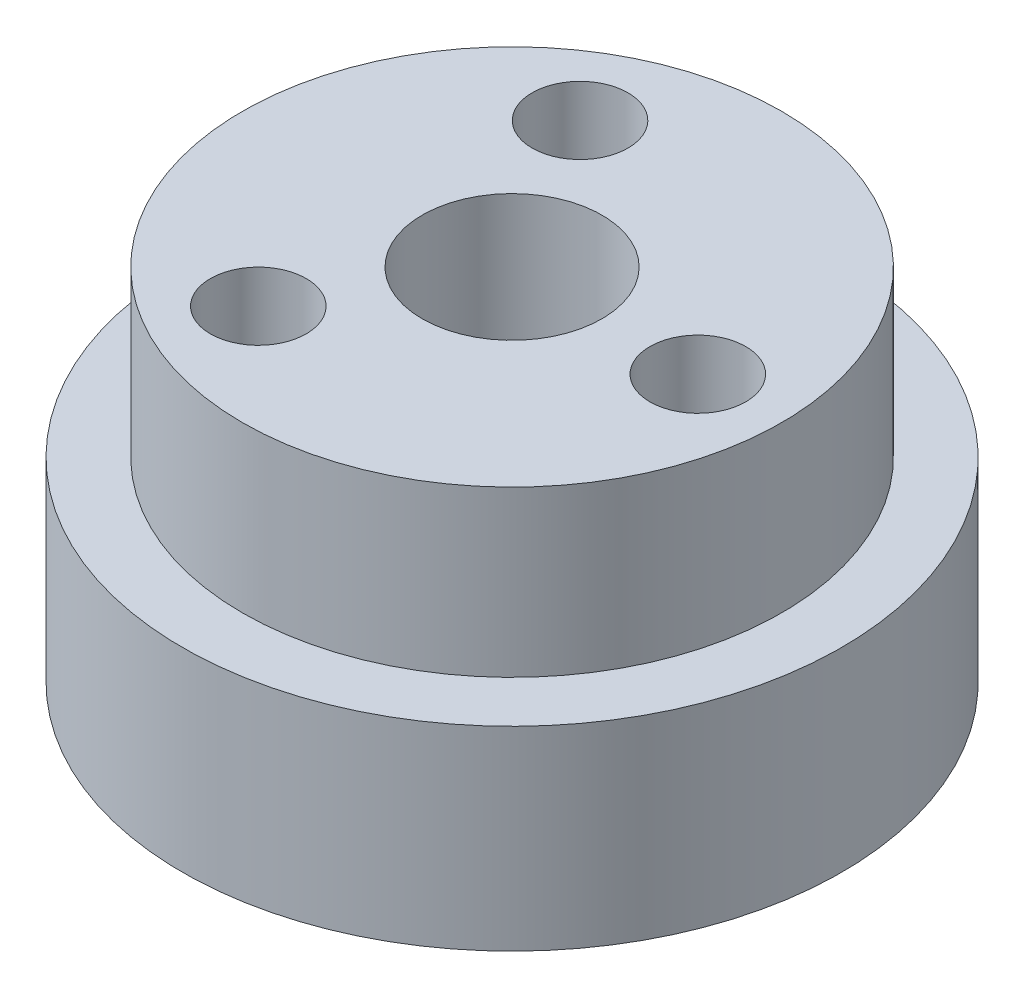
ISO-10303-21;
HEADER;
FILE_DESCRIPTION(('STEP AP214'),'2;1');
FILE_NAME('part.step','',(''),(''),'','','');
FILE_SCHEMA(('AUTOMOTIVE_DESIGN { 1 0 10303 214 1 1 1 1 }'));
ENDSEC;
DATA;
#1=APPLICATION_CONTEXT('core data for automotive mechanical design processes');
#2=APPLICATION_PROTOCOL_DEFINITION('international standard','automotive_design',2000,#1);
#3=PRODUCT_CONTEXT('',#1,'mechanical');
#4=PRODUCT('Part','Part','',(#3));
#5=PRODUCT_RELATED_PRODUCT_CATEGORY('part','',(#4));
#6=PRODUCT_DEFINITION_FORMATION('','',#4);
#7=PRODUCT_DEFINITION_CONTEXT('part definition',#1,'design');
#8=PRODUCT_DEFINITION('design','',#6,#7);
#9=PRODUCT_DEFINITION_SHAPE('','',#8);
#10=(LENGTH_UNIT() NAMED_UNIT(*) SI_UNIT(.MILLI.,.METRE.));
#11=(NAMED_UNIT(*) PLANE_ANGLE_UNIT() SI_UNIT($,.RADIAN.));
#12=(NAMED_UNIT(*) SI_UNIT($,.STERADIAN.) SOLID_ANGLE_UNIT());
#13=UNCERTAINTY_MEASURE_WITH_UNIT(LENGTH_MEASURE(1.E-05),#10,'distance_accuracy_value','');
#14=(GEOMETRIC_REPRESENTATION_CONTEXT(3) GLOBAL_UNCERTAINTY_ASSIGNED_CONTEXT((#13)) GLOBAL_UNIT_ASSIGNED_CONTEXT((#10,
#11,#12)) REPRESENTATION_CONTEXT('',''));
#15=CARTESIAN_POINT('',(0.,0.,0.));
#16=DIRECTION('',(0.,0.,1.));
#17=DIRECTION('',(1.,0.,0.));
#18=AXIS2_PLACEMENT_3D('',#15,#16,#17);
#19=CARTESIAN_POINT('',(-22.1200806780469,6.5,-12.8237677020571));
#20=DIRECTION('',(0.,-1.,0.));
#21=DIRECTION('',(0.,0.,-1.));
#22=AXIS2_PLACEMENT_3D('',#19,#20,#21);
#23=CYLINDRICAL_SURFACE('',#22,11.);
#24=CARTESIAN_POINT('',(-22.1200806780469,6.5,-12.8237677020571));
#25=DIRECTION('',(0.,1.,0.));
#26=DIRECTION('',(0.,0.,1.));
#27=AXIS2_PLACEMENT_3D('',#24,#25,#26);
#28=CIRCLE('',#27,11.);
#29=CARTESIAN_POINT('',(-22.1200806780469,6.5,-23.8237677020571));
#30=VERTEX_POINT('',#29);
#31=EDGE_CURVE('E45',#30,#30,#28,.T.);
#32=CARTESIAN_POINT('',(-22.1200806780469,0.,-12.8237677020571));
#33=DIRECTION('',(0.,1.,0.));
#34=DIRECTION('',(0.,0.,1.));
#35=AXIS2_PLACEMENT_3D('',#32,#33,#34);
#36=CIRCLE('',#35,11.);
#37=CARTESIAN_POINT('',(-22.1200806780469,0.,-23.8237677020571));
#38=VERTEX_POINT('',#37);
#39=EDGE_CURVE('E40',#38,#38,#36,.T.);
#40=CARTESIAN_POINT('',(-22.1200806780469,6.5,-23.8237677020571));
#41=CARTESIAN_POINT('',(-22.1200806780469,6.43229166666667,-23.8237677020571));
#42=CARTESIAN_POINT('',(-22.1200806780469,6.36458333333333,-23.8237677020571));
#43=CARTESIAN_POINT('',(-22.1200806780469,6.22916666666667,-23.8237677020571));
#44=CARTESIAN_POINT('',(-22.1200806780469,6.16145833333333,-23.8237677020571));
#45=CARTESIAN_POINT('',(-22.1200806780469,6.02604166666667,-23.8237677020571));
#46=CARTESIAN_POINT('',(-22.1200806780469,5.95833333333333,-23.8237677020571));
#47=CARTESIAN_POINT('',(-22.1200806780469,5.82291666666667,-23.8237677020571));
#48=CARTESIAN_POINT('',(-22.1200806780469,5.75520833333333,-23.8237677020571));
#49=CARTESIAN_POINT('',(-22.1200806780469,5.61979166666667,-23.8237677020571));
#50=CARTESIAN_POINT('',(-22.1200806780469,5.55208333333333,-23.8237677020571));
#51=CARTESIAN_POINT('',(-22.1200806780469,5.41666666666667,-23.8237677020571));
#52=CARTESIAN_POINT('',(-22.1200806780469,5.34895833333333,-23.8237677020571));
#53=CARTESIAN_POINT('',(-22.1200806780469,5.21354166666667,-23.8237677020571));
#54=CARTESIAN_POINT('',(-22.1200806780469,5.14583333333333,-23.8237677020571));
#55=CARTESIAN_POINT('',(-22.1200806780469,5.01041666666667,-23.8237677020571));
#56=CARTESIAN_POINT('',(-22.1200806780469,4.94270833333333,-23.8237677020571));
#57=CARTESIAN_POINT('',(-22.1200806780469,4.80729166666667,-23.8237677020571));
#58=CARTESIAN_POINT('',(-22.1200806780469,4.73958333333333,-23.8237677020571));
#59=CARTESIAN_POINT('',(-22.1200806780469,4.60416666666667,-23.8237677020571));
#60=CARTESIAN_POINT('',(-22.1200806780469,4.53645833333333,-23.8237677020571));
#61=CARTESIAN_POINT('',(-22.1200806780469,4.40104166666667,-23.8237677020571));
#62=CARTESIAN_POINT('',(-22.1200806780469,4.33333333333333,-23.8237677020571));
#63=CARTESIAN_POINT('',(-22.1200806780469,4.19791666666667,-23.8237677020571));
#64=CARTESIAN_POINT('',(-22.1200806780469,4.13020833333333,-23.8237677020571));
#65=CARTESIAN_POINT('',(-22.1200806780469,3.99479166666667,-23.8237677020571));
#66=CARTESIAN_POINT('',(-22.1200806780469,3.92708333333333,-23.8237677020571));
#67=CARTESIAN_POINT('',(-22.1200806780469,3.79166666666667,-23.8237677020571));
#68=CARTESIAN_POINT('',(-22.1200806780469,3.72395833333333,-23.8237677020571));
#69=CARTESIAN_POINT('',(-22.1200806780469,3.58854166666667,-23.8237677020571));
#70=CARTESIAN_POINT('',(-22.1200806780469,3.52083333333333,-23.8237677020571));
#71=CARTESIAN_POINT('',(-22.1200806780469,3.38541666666667,-23.8237677020571));
#72=CARTESIAN_POINT('',(-22.1200806780469,3.31770833333333,-23.8237677020571));
#73=CARTESIAN_POINT('',(-22.1200806780469,3.18229166666667,-23.8237677020571));
#74=CARTESIAN_POINT('',(-22.1200806780469,3.11458333333333,-23.8237677020571));
#75=CARTESIAN_POINT('',(-22.1200806780469,2.97916666666667,-23.8237677020571));
#76=CARTESIAN_POINT('',(-22.1200806780469,2.91145833333333,-23.8237677020571));
#77=CARTESIAN_POINT('',(-22.1200806780469,2.77604166666667,-23.8237677020571));
#78=CARTESIAN_POINT('',(-22.1200806780469,2.70833333333333,-23.8237677020571));
#79=CARTESIAN_POINT('',(-22.1200806780469,2.57291666666667,-23.8237677020571));
#80=CARTESIAN_POINT('',(-22.1200806780469,2.50520833333333,-23.8237677020571));
#81=CARTESIAN_POINT('',(-22.1200806780469,2.36979166666667,-23.8237677020571));
#82=CARTESIAN_POINT('',(-22.1200806780469,2.30208333333333,-23.8237677020571));
#83=CARTESIAN_POINT('',(-22.1200806780469,2.16666666666667,-23.8237677020571));
#84=CARTESIAN_POINT('',(-22.1200806780469,2.09895833333333,-23.8237677020571));
#85=CARTESIAN_POINT('',(-22.1200806780469,1.96354166666667,-23.8237677020571));
#86=CARTESIAN_POINT('',(-22.1200806780469,1.89583333333333,-23.8237677020571));
#87=CARTESIAN_POINT('',(-22.1200806780469,1.76041666666667,-23.8237677020571));
#88=CARTESIAN_POINT('',(-22.1200806780469,1.69270833333333,-23.8237677020571));
#89=CARTESIAN_POINT('',(-22.1200806780469,1.55729166666667,-23.8237677020571));
#90=CARTESIAN_POINT('',(-22.1200806780469,1.48958333333333,-23.8237677020571));
#91=CARTESIAN_POINT('',(-22.1200806780469,1.35416666666667,-23.8237677020571));
#92=CARTESIAN_POINT('',(-22.1200806780469,1.28645833333333,-23.8237677020571));
#93=CARTESIAN_POINT('',(-22.1200806780469,1.15104166666667,-23.8237677020571));
#94=CARTESIAN_POINT('',(-22.1200806780469,1.08333333333333,-23.8237677020571));
#95=CARTESIAN_POINT('',(-22.1200806780469,0.947916666666667,-23.8237677020571));
#96=CARTESIAN_POINT('',(-22.1200806780469,0.880208333333333,-23.8237677020571));
#97=CARTESIAN_POINT('',(-22.1200806780469,0.744791666666667,-23.8237677020571));
#98=CARTESIAN_POINT('',(-22.1200806780469,0.677083333333333,-23.8237677020571));
#99=CARTESIAN_POINT('',(-22.1200806780469,0.541666666666667,-23.8237677020571));
#100=CARTESIAN_POINT('',(-22.1200806780469,0.473958333333333,-23.8237677020571));
#101=CARTESIAN_POINT('',(-22.1200806780469,0.338541666666667,-23.8237677020571));
#102=CARTESIAN_POINT('',(-22.1200806780469,0.270833333333334,-23.8237677020571));
#103=CARTESIAN_POINT('',(-22.1200806780469,0.135416666666667,-23.8237677020571));
#104=CARTESIAN_POINT('',(-22.1200806780469,0.0677083333333334,-23.8237677020571));
#105=CARTESIAN_POINT('',(-22.1200806780469,0.,-23.8237677020571));
#106=B_SPLINE_CURVE_WITH_KNOTS('',3,(#40,#41,#42,#43,#44,#45,#46,#47,#48,#49,#50,#51,#52,#53,
#54,#55,#56,#57,#58,#59,#60,#61,#62,#63,#64,#65,#66,#67,#68,#69,#70,#71,#72,#73,#74,#75,#76,#77,
#78,#79,#80,#81,#82,#83,#84,#85,#86,#87,#88,#89,#90,#91,#92,#93,#94,#95,#96,#97,#98,#99,#100,
#101,#102,#103,#104,#105),.UNSPECIFIED.,.F.,.F.,(4,2,2,2,2,2,2,2,2,2,2,2,2,2,2,2,2,2,2,2,2,2,2,
2,2,2,2,2,2,2,2,2,4),(0.,0.203125,0.40625,0.609375000000001,0.812500000000001,1.015625,1.21875,
1.421875,1.625,1.828125,2.03125,2.234375,2.4375,2.640625,2.84375,3.046875,3.25,3.453125,3.65625,
3.859375,4.0625,4.265625,4.46875,4.671875,4.875,5.078125,5.28125,5.484375,5.6875,5.890625,
6.09375,6.296875,6.5),.UNSPECIFIED.);
#107=EDGE_CURVE('BSEAM37',#30,#38,#106,.T.);
#108=ORIENTED_EDGE('',*,*,#31,.F.);
#109=ORIENTED_EDGE('',*,*,#39,.T.);
#110=ORIENTED_EDGE('',*,*,#107,.T.);
#111=ORIENTED_EDGE('',*,*,#107,.F.);
#112=EDGE_LOOP('',(#108,#110,#109,#111));
#113=FACE_BOUND('',#112,.T.);
#114=ADVANCED_FACE('F37',(#113),#23,.T.);
#115=CARTESIAN_POINT('',(-22.1200806780469,6.5,-12.8237677020571));
#116=DIRECTION('',(0.,1.,0.));
#117=DIRECTION('',(0.,0.,1.));
#118=AXIS2_PLACEMENT_3D('',#115,#116,#117);
#119=PLANE('',#118);
#120=CARTESIAN_POINT('',(-22.1200806780469,6.5,-12.8237677020571));
#121=DIRECTION('',(0.,1.,0.));
#122=DIRECTION('',(0.,0.,1.));
#123=AXIS2_PLACEMENT_3D('',#120,#121,#122);
#124=CIRCLE('',#123,9.);
#125=CARTESIAN_POINT('',(-22.1200806780469,6.5,-3.82376770205708));
#126=VERTEX_POINT('',#125);
#127=EDGE_CURVE('E10',#126,#126,#124,.T.);
#128=ORIENTED_EDGE('',*,*,#127,.F.);
#129=EDGE_LOOP('',(#128));
#130=FACE_BOUND('',#129,.T.);
#131=ORIENTED_EDGE('',*,*,#31,.T.);
#132=EDGE_LOOP('',(#131));
#133=FACE_BOUND('',#132,.T.);
#134=ADVANCED_FACE('F112',(#130,#133),#119,.T.);
#135=CARTESIAN_POINT('',(-22.1200806780469,0.,-12.8237677020571));
#136=DIRECTION('',(0.,1.,0.));
#137=DIRECTION('',(0.,0.,1.));
#138=AXIS2_PLACEMENT_3D('',#135,#136,#137);
#139=PLANE('',#138);
#140=CARTESIAN_POINT('',(-25.2200806780469,0.,-18.1931252055206));
#141=DIRECTION('',(0.,1.,0.));
#142=DIRECTION('',(0.,0.,1.));
#143=AXIS2_PLACEMENT_3D('',#140,#141,#142);
#144=CIRCLE('',#143,1.6);
#145=CARTESIAN_POINT('',(-25.2200806780469,0.,-16.5931252055206));
#146=VERTEX_POINT('',#145);
#147=EDGE_CURVE('E72',#146,#146,#144,.T.);
#148=ORIENTED_EDGE('',*,*,#147,.T.);
#149=EDGE_LOOP('',(#148));
#150=FACE_BOUND('',#149,.T.);
#151=CARTESIAN_POINT('',(-25.2200806780468,0.,-7.45441019859353));
#152=DIRECTION('',(0.,1.,0.));
#153=DIRECTION('',(0.,0.,1.));
#154=AXIS2_PLACEMENT_3D('',#151,#152,#153);
#155=CIRCLE('',#154,1.6);
#156=CARTESIAN_POINT('',(-25.2200806780468,0.,-5.85441019859353));
#157=VERTEX_POINT('',#156);
#158=EDGE_CURVE('E76',#157,#157,#155,.T.);
#159=ORIENTED_EDGE('',*,*,#158,.T.);
#160=EDGE_LOOP('',(#159));
#161=FACE_BOUND('',#160,.T.);
#162=CARTESIAN_POINT('',(-15.9200806780469,0.,-12.8237677020571));
#163=DIRECTION('',(0.,1.,0.));
#164=DIRECTION('',(0.,0.,1.));
#165=AXIS2_PLACEMENT_3D('',#162,#163,#164);
#166=CIRCLE('',#165,1.6);
#167=CARTESIAN_POINT('',(-15.9200806780469,0.,-11.2237677020571));
#168=VERTEX_POINT('',#167);
#169=EDGE_CURVE('E64',#168,#168,#166,.T.);
#170=ORIENTED_EDGE('',*,*,#169,.T.);
#171=EDGE_LOOP('',(#170));
#172=FACE_BOUND('',#171,.T.);
#173=CARTESIAN_POINT('',(-22.1200806780469,0.,-12.8237677020571));
#174=DIRECTION('',(0.,1.,0.));
#175=DIRECTION('',(0.,0.,1.));
#176=AXIS2_PLACEMENT_3D('',#173,#174,#175);
#177=CIRCLE('',#176,3.);
#178=CARTESIAN_POINT('',(-22.1200806780469,0.,-9.82376770205708));
#179=VERTEX_POINT('',#178);
#180=EDGE_CURVE('E56',#179,#179,#177,.T.);
#181=ORIENTED_EDGE('',*,*,#180,.T.);
#182=EDGE_LOOP('',(#181));
#183=FACE_BOUND('',#182,.T.);
#184=ORIENTED_EDGE('',*,*,#39,.F.);
#185=EDGE_LOOP('',(#184));
#186=FACE_BOUND('',#185,.T.);
#187=ADVANCED_FACE('F107',(#150,#161,#172,#183,#186),#139,.F.);
#188=CARTESIAN_POINT('',(-22.1200806780469,12.,-12.8237677020571));
#189=DIRECTION('',(0.,-1.,0.));
#190=DIRECTION('',(0.,0.,-1.));
#191=AXIS2_PLACEMENT_3D('',#188,#189,#190);
#192=CYLINDRICAL_SURFACE('',#191,9.);
#193=CARTESIAN_POINT('',(-22.1200806780469,12.,-12.8237677020571));
#194=DIRECTION('',(0.,1.,0.));
#195=DIRECTION('',(0.,0.,1.));
#196=AXIS2_PLACEMENT_3D('',#193,#194,#195);
#197=CIRCLE('',#196,9.);
#198=CARTESIAN_POINT('',(-22.1200806780469,12.,-3.82376770205708));
#199=VERTEX_POINT('',#198);
#200=EDGE_CURVE('E52',#199,#199,#197,.T.);
#201=ORIENTED_EDGE('',*,*,#200,.F.);
#202=EDGE_LOOP('',(#201));
#203=FACE_BOUND('',#202,.T.);
#204=ORIENTED_EDGE('',*,*,#127,.T.);
#205=EDGE_LOOP('',(#204));
#206=FACE_BOUND('',#205,.T.);
#207=ADVANCED_FACE('F96',(#203,#206),#192,.T.);
#208=CARTESIAN_POINT('',(-22.1200806780469,12.,-12.8237677020571));
#209=DIRECTION('',(0.,1.,0.));
#210=DIRECTION('',(0.,0.,1.));
#211=AXIS2_PLACEMENT_3D('',#208,#209,#210);
#212=PLANE('',#211);
#213=CARTESIAN_POINT('',(-25.2200806780469,12.,-18.1931252055206));
#214=DIRECTION('',(0.,1.,0.));
#215=DIRECTION('',(0.866025403784436,0.,-0.500000000000004));
#216=AXIS2_PLACEMENT_3D('',#213,#214,#215);
#217=CIRCLE('',#216,1.6);
#218=CARTESIAN_POINT('',(-23.8344400319918,12.,-18.9931252055206));
#219=VERTEX_POINT('',#218);
#220=EDGE_CURVE('E80',#219,#219,#217,.T.);
#221=ORIENTED_EDGE('',*,*,#220,.F.);
#222=EDGE_LOOP('',(#221));
#223=FACE_BOUND('',#222,.T.);
#224=CARTESIAN_POINT('',(-25.2200806780468,12.,-7.45441019859353));
#225=DIRECTION('',(0.,1.,0.));
#226=DIRECTION('',(-0.866025403784443,0.,-0.499999999999992));
#227=AXIS2_PLACEMENT_3D('',#224,#225,#226);
#228=CIRCLE('',#227,1.6);
#229=CARTESIAN_POINT('',(-26.6057213241019,12.,-8.25441019859351));
#230=VERTEX_POINT('',#229);
#231=EDGE_CURVE('E81',#230,#230,#228,.T.);
#232=ORIENTED_EDGE('',*,*,#231,.F.);
#233=EDGE_LOOP('',(#232));
#234=FACE_BOUND('',#233,.T.);
#235=CARTESIAN_POINT('',(-15.9200806780469,12.,-12.8237677020571));
#236=DIRECTION('',(0.,1.,0.));
#237=DIRECTION('',(0.,0.,1.));
#238=AXIS2_PLACEMENT_3D('',#235,#236,#237);
#239=CIRCLE('',#238,1.6);
#240=CARTESIAN_POINT('',(-15.9200806780469,12.,-11.2237677020571));
#241=VERTEX_POINT('',#240);
#242=EDGE_CURVE('E68',#241,#241,#239,.T.);
#243=ORIENTED_EDGE('',*,*,#242,.F.);
#244=EDGE_LOOP('',(#243));
#245=FACE_BOUND('',#244,.T.);
#246=CARTESIAN_POINT('',(-22.1200806780469,12.,-12.8237677020571));
#247=DIRECTION('',(0.,1.,0.));
#248=DIRECTION('',(0.,0.,1.));
#249=AXIS2_PLACEMENT_3D('',#246,#247,#248);
#250=CIRCLE('',#249,3.);
#251=CARTESIAN_POINT('',(-22.1200806780469,12.,-9.82376770205708));
#252=VERTEX_POINT('',#251);
#253=EDGE_CURVE('E60',#252,#252,#250,.T.);
#254=ORIENTED_EDGE('',*,*,#253,.F.);
#255=EDGE_LOOP('',(#254));
#256=FACE_BOUND('',#255,.T.);
#257=ORIENTED_EDGE('',*,*,#200,.T.);
#258=EDGE_LOOP('',(#257));
#259=FACE_BOUND('',#258,.T.);
#260=ADVANCED_FACE('F92',(#223,#234,#245,#256,#259),#212,.T.);
#261=CARTESIAN_POINT('',(-22.1200806780469,-3.5,-12.8237677020571));
#262=DIRECTION('',(0.,1.,0.));
#263=DIRECTION('',(0.,0.,1.));
#264=AXIS2_PLACEMENT_3D('',#261,#262,#263);
#265=CYLINDRICAL_SURFACE('',#264,3.);
#266=ORIENTED_EDGE('',*,*,#253,.T.);
#267=EDGE_LOOP('',(#266));
#268=FACE_BOUND('',#267,.T.);
#269=ORIENTED_EDGE('',*,*,#180,.F.);
#270=EDGE_LOOP('',(#269));
#271=FACE_BOUND('',#270,.T.);
#272=ADVANCED_FACE('F95',(#268,#271),#265,.F.);
#273=CARTESIAN_POINT('',(-15.9200806780469,-3.5,-12.8237677020571));
#274=DIRECTION('',(0.,1.,0.));
#275=DIRECTION('',(0.,0.,1.));
#276=AXIS2_PLACEMENT_3D('',#273,#274,#275);
#277=CYLINDRICAL_SURFACE('',#276,1.6);
#278=ORIENTED_EDGE('',*,*,#242,.T.);
#279=EDGE_LOOP('',(#278));
#280=FACE_BOUND('',#279,.T.);
#281=ORIENTED_EDGE('',*,*,#169,.F.);
#282=EDGE_LOOP('',(#281));
#283=FACE_BOUND('',#282,.T.);
#284=ADVANCED_FACE('F141',(#280,#283),#277,.F.);
#285=CARTESIAN_POINT('',(-25.2200806780468,-3.5,-7.45441019859353));
#286=DIRECTION('',(0.,1.,0.));
#287=DIRECTION('',(0.,0.,1.));
#288=AXIS2_PLACEMENT_3D('',#285,#286,#287);
#289=CYLINDRICAL_SURFACE('',#288,1.6);
#290=ORIENTED_EDGE('',*,*,#231,.T.);
#291=EDGE_LOOP('',(#290));
#292=FACE_BOUND('',#291,.T.);
#293=ORIENTED_EDGE('',*,*,#158,.F.);
#294=EDGE_LOOP('',(#293));
#295=FACE_BOUND('',#294,.T.);
#296=ADVANCED_FACE('F154',(#292,#295),#289,.F.);
#297=CARTESIAN_POINT('',(-25.2200806780469,-3.5,-18.1931252055206));
#298=DIRECTION('',(0.,1.,0.));
#299=DIRECTION('',(0.,0.,1.));
#300=AXIS2_PLACEMENT_3D('',#297,#298,#299);
#301=CYLINDRICAL_SURFACE('',#300,1.6);
#302=ORIENTED_EDGE('',*,*,#220,.T.);
#303=EDGE_LOOP('',(#302));
#304=FACE_BOUND('',#303,.T.);
#305=ORIENTED_EDGE('',*,*,#147,.F.);
#306=EDGE_LOOP('',(#305));
#307=FACE_BOUND('',#306,.T.);
#308=ADVANCED_FACE('F89',(#304,#307),#301,.F.);
#309=CLOSED_SHELL('',(#114,#134,#187,#207,#260,#272,#284,#296,#308));
#310=MANIFOLD_SOLID_BREP('B2',#309);
#311=ADVANCED_BREP_SHAPE_REPRESENTATION('',(#18,#310),#14);
#312=SHAPE_DEFINITION_REPRESENTATION(#9,#311);
ENDSEC;
END-ISO-10303-21;
